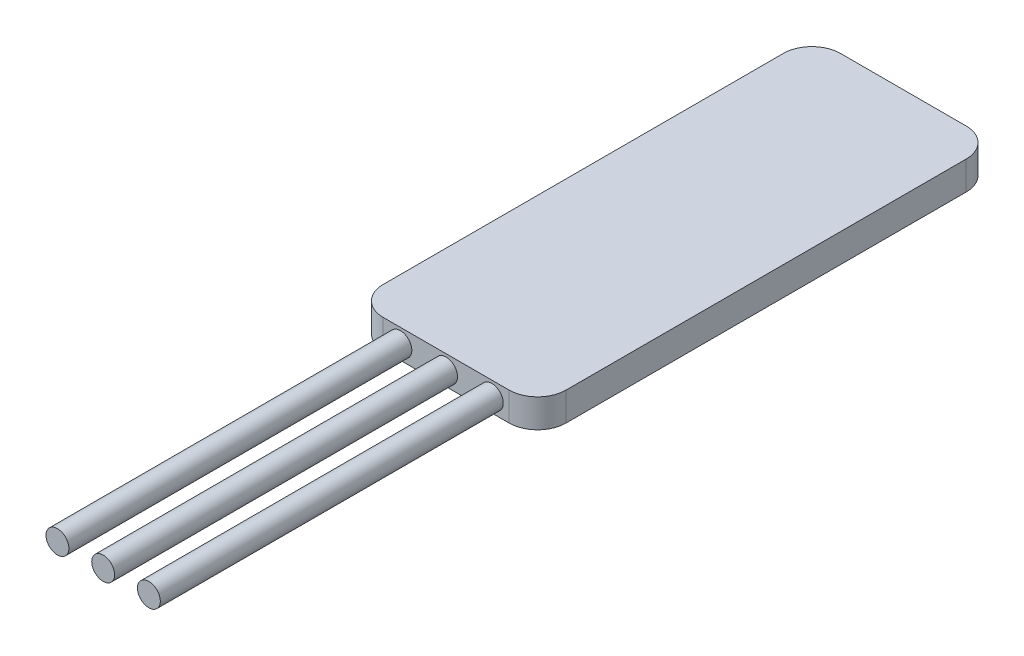
ISO-10303-21;
HEADER;
FILE_DESCRIPTION(('STEP AP214'),'2;1');
FILE_NAME('part.step','',(''),(''),'','','');
FILE_SCHEMA(('AUTOMOTIVE_DESIGN { 1 0 10303 214 1 1 1 1 }'));
ENDSEC;
DATA;
#1=APPLICATION_CONTEXT('core data for automotive mechanical design processes');
#2=APPLICATION_PROTOCOL_DEFINITION('international standard','automotive_design',2000,#1);
#3=PRODUCT_CONTEXT('',#1,'mechanical');
#4=PRODUCT('Part','Part','',(#3));
#5=PRODUCT_RELATED_PRODUCT_CATEGORY('part','',(#4));
#6=PRODUCT_DEFINITION_FORMATION('','',#4);
#7=PRODUCT_DEFINITION_CONTEXT('part definition',#1,'design');
#8=PRODUCT_DEFINITION('design','',#6,#7);
#9=PRODUCT_DEFINITION_SHAPE('','',#8);
#10=(LENGTH_UNIT() NAMED_UNIT(*) SI_UNIT(.MILLI.,.METRE.));
#11=(NAMED_UNIT(*) PLANE_ANGLE_UNIT() SI_UNIT($,.RADIAN.));
#12=(NAMED_UNIT(*) SI_UNIT($,.STERADIAN.) SOLID_ANGLE_UNIT());
#13=UNCERTAINTY_MEASURE_WITH_UNIT(LENGTH_MEASURE(1.E-05),#10,'distance_accuracy_value','');
#14=(GEOMETRIC_REPRESENTATION_CONTEXT(3) GLOBAL_UNCERTAINTY_ASSIGNED_CONTEXT((#13)) GLOBAL_UNIT_ASSIGNED_CONTEXT((#10,
#11,#12)) REPRESENTATION_CONTEXT('',''));
#15=CARTESIAN_POINT('',(0.,0.,0.));
#16=DIRECTION('',(0.,0.,1.));
#17=DIRECTION('',(1.,0.,0.));
#18=AXIS2_PLACEMENT_3D('',#15,#16,#17);
#19=CARTESIAN_POINT('',(3.2,0.5,-8.));
#20=DIRECTION('',(-1.,0.,0.));
#21=DIRECTION('',(0.,0.,1.));
#22=AXIS2_PLACEMENT_3D('',#19,#20,#21);
#23=PLANE('',#22);
#24=DIRECTION('',(0.,0.,-1.));
#25=VECTOR('',#24,1.);
#26=CARTESIAN_POINT('',(3.2,-0.5,-8.));
#27=LINE('',#26,#25);
#28=CARTESIAN_POINT('',(3.2,-0.5,7.));
#29=VERTEX_POINT('',#28);
#30=CARTESIAN_POINT('',(3.2,-0.5,-7.));
#31=VERTEX_POINT('',#30);
#32=EDGE_CURVE('E134',#29,#31,#27,.T.);
#33=ORIENTED_EDGE('',*,*,#32,.T.);
#34=DIRECTION('',(0.,-1.,0.));
#35=VECTOR('',#34,1.);
#36=CARTESIAN_POINT('',(3.2,0.5,-7.));
#37=LINE('',#36,#35);
#38=CARTESIAN_POINT('',(3.2,0.5,-7.));
#39=VERTEX_POINT('',#38);
#40=EDGE_CURVE('E156',#31,#39,#37,.F.);
#41=ORIENTED_EDGE('',*,*,#40,.T.);
#42=DIRECTION('',(0.,0.,-1.));
#43=VECTOR('',#42,1.);
#44=CARTESIAN_POINT('',(3.2,0.5,-8.));
#45=LINE('',#44,#43);
#46=CARTESIAN_POINT('',(3.2,0.5,7.));
#47=VERTEX_POINT('',#46);
#48=EDGE_CURVE('E132',#47,#39,#45,.T.);
#49=ORIENTED_EDGE('',*,*,#48,.F.);
#50=DIRECTION('',(0.,-1.,0.));
#51=VECTOR('',#50,1.);
#52=CARTESIAN_POINT('',(3.2,0.5,7.));
#53=LINE('',#52,#51);
#54=EDGE_CURVE('E153',#47,#29,#53,.T.);
#55=ORIENTED_EDGE('',*,*,#54,.T.);
#56=EDGE_LOOP('',(#33,#41,#49,#55));
#57=FACE_BOUND('',#56,.T.);
#58=ADVANCED_FACE('F36',(#57),#23,.F.);
#59=CARTESIAN_POINT('',(-3.2,0.5,-8.));
#60=DIRECTION('',(0.,0.,1.));
#61=DIRECTION('',(1.,0.,0.));
#62=AXIS2_PLACEMENT_3D('',#59,#60,#61);
#63=PLANE('',#62);
#64=DIRECTION('',(-1.,0.,0.));
#65=VECTOR('',#64,1.);
#66=CARTESIAN_POINT('',(-3.2,-0.5,-8.));
#67=LINE('',#66,#65);
#68=CARTESIAN_POINT('',(2.2,-0.5,-8.));
#69=VERTEX_POINT('',#68);
#70=CARTESIAN_POINT('',(-2.2,-0.5,-8.));
#71=VERTEX_POINT('',#70);
#72=EDGE_CURVE('E130',#69,#71,#67,.T.);
#73=ORIENTED_EDGE('',*,*,#72,.T.);
#74=DIRECTION('',(0.,-1.,0.));
#75=VECTOR('',#74,1.);
#76=CARTESIAN_POINT('',(-2.2,0.5,-8.));
#77=LINE('',#76,#75);
#78=CARTESIAN_POINT('',(-2.2,0.5,-8.));
#79=VERTEX_POINT('',#78);
#80=EDGE_CURVE('E108',#71,#79,#77,.F.);
#81=ORIENTED_EDGE('',*,*,#80,.T.);
#82=DIRECTION('',(-1.,0.,0.));
#83=VECTOR('',#82,1.);
#84=CARTESIAN_POINT('',(-3.2,0.5,-8.));
#85=LINE('',#84,#83);
#86=CARTESIAN_POINT('',(2.2,0.5,-8.));
#87=VERTEX_POINT('',#86);
#88=EDGE_CURVE('E182',#87,#79,#85,.T.);
#89=ORIENTED_EDGE('',*,*,#88,.F.);
#90=DIRECTION('',(0.,-1.,0.));
#91=VECTOR('',#90,1.);
#92=CARTESIAN_POINT('',(2.2,0.5,-8.));
#93=LINE('',#92,#91);
#94=EDGE_CURVE('E113',#87,#69,#93,.T.);
#95=ORIENTED_EDGE('',*,*,#94,.T.);
#96=EDGE_LOOP('',(#73,#81,#89,#95));
#97=FACE_BOUND('',#96,.T.);
#98=ADVANCED_FACE('F209',(#97),#63,.F.);
#99=CARTESIAN_POINT('',(-3.2,0.5,-8.));
#100=DIRECTION('',(1.,0.,0.));
#101=DIRECTION('',(0.,0.,-1.));
#102=AXIS2_PLACEMENT_3D('',#99,#100,#101);
#103=PLANE('',#102);
#104=DIRECTION('',(0.,0.,1.));
#105=VECTOR('',#104,1.);
#106=CARTESIAN_POINT('',(-3.2,0.5,-8.));
#107=LINE('',#106,#105);
#108=CARTESIAN_POINT('',(-3.2,0.5,-7.));
#109=VERTEX_POINT('',#108);
#110=CARTESIAN_POINT('',(-3.2,0.5,7.));
#111=VERTEX_POINT('',#110);
#112=EDGE_CURVE('E122',#109,#111,#107,.T.);
#113=ORIENTED_EDGE('',*,*,#112,.F.);
#114=DIRECTION('',(0.,-1.,0.));
#115=VECTOR('',#114,1.);
#116=CARTESIAN_POINT('',(-3.2,0.5,-7.));
#117=LINE('',#116,#115);
#118=CARTESIAN_POINT('',(-3.2,-0.5,-7.));
#119=VERTEX_POINT('',#118);
#120=EDGE_CURVE('E107',#109,#119,#117,.T.);
#121=ORIENTED_EDGE('',*,*,#120,.T.);
#122=DIRECTION('',(0.,0.,1.));
#123=VECTOR('',#122,1.);
#124=CARTESIAN_POINT('',(-3.2,-0.5,-8.));
#125=LINE('',#124,#123);
#126=CARTESIAN_POINT('',(-3.2,-0.5,7.));
#127=VERTEX_POINT('',#126);
#128=EDGE_CURVE('E120',#119,#127,#125,.T.);
#129=ORIENTED_EDGE('',*,*,#128,.T.);
#130=DIRECTION('',(0.,-1.,0.));
#131=VECTOR('',#130,1.);
#132=CARTESIAN_POINT('',(-3.2,0.5,7.));
#133=LINE('',#132,#131);
#134=EDGE_CURVE('E124',#127,#111,#133,.F.);
#135=ORIENTED_EDGE('',*,*,#134,.T.);
#136=EDGE_LOOP('',(#113,#121,#129,#135));
#137=FACE_BOUND('',#136,.T.);
#138=ADVANCED_FACE('F119',(#137),#103,.F.);
#139=CARTESIAN_POINT('',(-3.2,0.5,8.));
#140=DIRECTION('',(0.,0.,-1.));
#141=DIRECTION('',(-1.,0.,0.));
#142=AXIS2_PLACEMENT_3D('',#139,#140,#141);
#143=PLANE('',#142);
#144=CARTESIAN_POINT('',(1.6,0.,8.));
#145=DIRECTION('',(0.,0.,-1.));
#146=DIRECTION('',(-1.,0.,0.));
#147=AXIS2_PLACEMENT_3D('',#144,#145,#146);
#148=CIRCLE('',#147,0.4);
#149=CARTESIAN_POINT('',(1.2,0.,8.));
#150=VERTEX_POINT('',#149);
#151=EDGE_CURVE('E11',#150,#150,#148,.F.);
#152=ORIENTED_EDGE('',*,*,#151,.F.);
#153=EDGE_LOOP('',(#152));
#154=FACE_BOUND('',#153,.T.);
#155=CARTESIAN_POINT('',(-1.6,0.,8.));
#156=DIRECTION('',(0.,0.,-1.));
#157=DIRECTION('',(-1.,0.,0.));
#158=AXIS2_PLACEMENT_3D('',#155,#156,#157);
#159=CIRCLE('',#158,0.4);
#160=CARTESIAN_POINT('',(-2.,0.,8.));
#161=VERTEX_POINT('',#160);
#162=EDGE_CURVE('E44',#161,#161,#159,.F.);
#163=ORIENTED_EDGE('',*,*,#162,.F.);
#164=EDGE_LOOP('',(#163));
#165=FACE_BOUND('',#164,.T.);
#166=CARTESIAN_POINT('',(0.,0.,8.));
#167=DIRECTION('',(0.,0.,-1.));
#168=DIRECTION('',(-1.,0.,0.));
#169=AXIS2_PLACEMENT_3D('',#166,#167,#168);
#170=CIRCLE('',#169,0.4);
#171=CARTESIAN_POINT('',(-0.4,0.,8.));
#172=VERTEX_POINT('',#171);
#173=EDGE_CURVE('E162',#172,#172,#170,.F.);
#174=ORIENTED_EDGE('',*,*,#173,.F.);
#175=EDGE_LOOP('',(#174));
#176=FACE_BOUND('',#175,.T.);
#177=DIRECTION('',(1.,0.,0.));
#178=VECTOR('',#177,1.);
#179=CARTESIAN_POINT('',(-3.2,0.5,8.));
#180=LINE('',#179,#178);
#181=CARTESIAN_POINT('',(-2.2,0.5,8.));
#182=VERTEX_POINT('',#181);
#183=CARTESIAN_POINT('',(2.2,0.5,8.));
#184=VERTEX_POINT('',#183);
#185=EDGE_CURVE('E138',#182,#184,#180,.T.);
#186=ORIENTED_EDGE('',*,*,#185,.F.);
#187=DIRECTION('',(0.,-1.,0.));
#188=VECTOR('',#187,1.);
#189=CARTESIAN_POINT('',(-2.2,0.5,8.));
#190=LINE('',#189,#188);
#191=CARTESIAN_POINT('',(-2.2,-0.5,8.));
#192=VERTEX_POINT('',#191);
#193=EDGE_CURVE('E159',#182,#192,#190,.T.);
#194=ORIENTED_EDGE('',*,*,#193,.T.);
#195=DIRECTION('',(1.,0.,0.));
#196=VECTOR('',#195,1.);
#197=CARTESIAN_POINT('',(-3.2,-0.5,8.));
#198=LINE('',#197,#196);
#199=CARTESIAN_POINT('',(2.2,-0.5,8.));
#200=VERTEX_POINT('',#199);
#201=EDGE_CURVE('E129',#192,#200,#198,.T.);
#202=ORIENTED_EDGE('',*,*,#201,.T.);
#203=DIRECTION('',(0.,-1.,0.));
#204=VECTOR('',#203,1.);
#205=CARTESIAN_POINT('',(2.2,0.5,8.));
#206=LINE('',#205,#204);
#207=EDGE_CURVE('E51',#200,#184,#206,.F.);
#208=ORIENTED_EDGE('',*,*,#207,.T.);
#209=EDGE_LOOP('',(#186,#194,#202,#208));
#210=FACE_BOUND('',#209,.T.);
#211=ADVANCED_FACE('F169',(#154,#165,#176,#210),#143,.F.);
#212=CARTESIAN_POINT('',(0.,0.5,0.));
#213=DIRECTION('',(0.,1.,0.));
#214=DIRECTION('',(0.,0.,1.));
#215=AXIS2_PLACEMENT_3D('',#212,#213,#214);
#216=PLANE('',#215);
#217=ORIENTED_EDGE('',*,*,#88,.T.);
#218=CARTESIAN_POINT('',(-2.2,0.5,-7.));
#219=DIRECTION('',(0.,1.,0.));
#220=DIRECTION('',(0.,0.,1.));
#221=AXIS2_PLACEMENT_3D('',#218,#219,#220);
#222=CIRCLE('',#221,1.);
#223=EDGE_CURVE('E151',#79,#109,#222,.T.);
#224=ORIENTED_EDGE('',*,*,#223,.T.);
#225=ORIENTED_EDGE('',*,*,#112,.T.);
#226=CARTESIAN_POINT('',(-2.2,0.5,7.));
#227=DIRECTION('',(0.,1.,0.));
#228=DIRECTION('',(0.,0.,1.));
#229=AXIS2_PLACEMENT_3D('',#226,#227,#228);
#230=CIRCLE('',#229,1.);
#231=EDGE_CURVE('E58',#111,#182,#230,.T.);
#232=ORIENTED_EDGE('',*,*,#231,.T.);
#233=ORIENTED_EDGE('',*,*,#185,.T.);
#234=CARTESIAN_POINT('',(2.2,0.5,7.));
#235=DIRECTION('',(0.,1.,0.));
#236=DIRECTION('',(0.,0.,1.));
#237=AXIS2_PLACEMENT_3D('',#234,#235,#236);
#238=CIRCLE('',#237,1.);
#239=EDGE_CURVE('E146',#184,#47,#238,.T.);
#240=ORIENTED_EDGE('',*,*,#239,.T.);
#241=ORIENTED_EDGE('',*,*,#48,.T.);
#242=CARTESIAN_POINT('',(2.2,0.5,-7.));
#243=DIRECTION('',(0.,1.,0.));
#244=DIRECTION('',(0.,0.,1.));
#245=AXIS2_PLACEMENT_3D('',#242,#243,#244);
#246=CIRCLE('',#245,1.);
#247=EDGE_CURVE('E149',#39,#87,#246,.T.);
#248=ORIENTED_EDGE('',*,*,#247,.T.);
#249=EDGE_LOOP('',(#217,#224,#225,#232,#233,#240,#241,#248));
#250=FACE_BOUND('',#249,.T.);
#251=ADVANCED_FACE('F172',(#250),#216,.T.);
#252=CARTESIAN_POINT('',(0.,-0.5,0.));
#253=DIRECTION('',(0.,1.,0.));
#254=DIRECTION('',(0.,0.,1.));
#255=AXIS2_PLACEMENT_3D('',#252,#253,#254);
#256=PLANE('',#255);
#257=ORIENTED_EDGE('',*,*,#128,.F.);
#258=CARTESIAN_POINT('',(-2.2,-0.5,-7.));
#259=DIRECTION('',(0.,1.,0.));
#260=DIRECTION('',(0.,0.,1.));
#261=AXIS2_PLACEMENT_3D('',#258,#259,#260);
#262=CIRCLE('',#261,1.);
#263=EDGE_CURVE('E103',#119,#71,#262,.F.);
#264=ORIENTED_EDGE('',*,*,#263,.T.);
#265=ORIENTED_EDGE('',*,*,#72,.F.);
#266=CARTESIAN_POINT('',(2.2,-0.5,-7.));
#267=DIRECTION('',(0.,1.,0.));
#268=DIRECTION('',(0.,0.,1.));
#269=AXIS2_PLACEMENT_3D('',#266,#267,#268);
#270=CIRCLE('',#269,1.);
#271=EDGE_CURVE('E114',#69,#31,#270,.F.);
#272=ORIENTED_EDGE('',*,*,#271,.T.);
#273=ORIENTED_EDGE('',*,*,#32,.F.);
#274=CARTESIAN_POINT('',(2.2,-0.5,7.));
#275=DIRECTION('',(0.,1.,0.));
#276=DIRECTION('',(0.,0.,1.));
#277=AXIS2_PLACEMENT_3D('',#274,#275,#276);
#278=CIRCLE('',#277,1.);
#279=EDGE_CURVE('E123',#29,#200,#278,.F.);
#280=ORIENTED_EDGE('',*,*,#279,.T.);
#281=ORIENTED_EDGE('',*,*,#201,.F.);
#282=CARTESIAN_POINT('',(-2.2,-0.5,7.));
#283=DIRECTION('',(0.,1.,0.));
#284=DIRECTION('',(0.,0.,1.));
#285=AXIS2_PLACEMENT_3D('',#282,#283,#284);
#286=CIRCLE('',#285,1.);
#287=EDGE_CURVE('E128',#192,#127,#286,.F.);
#288=ORIENTED_EDGE('',*,*,#287,.T.);
#289=EDGE_LOOP('',(#257,#264,#265,#272,#273,#280,#281,#288));
#290=FACE_BOUND('',#289,.T.);
#291=ADVANCED_FACE('F126',(#290),#256,.F.);
#292=CARTESIAN_POINT('',(-2.2,0.5,-7.));
#293=DIRECTION('',(0.,-1.,0.));
#294=DIRECTION('',(0.,0.,-1.));
#295=AXIS2_PLACEMENT_3D('',#292,#293,#294);
#296=CYLINDRICAL_SURFACE('',#295,1.);
#297=ORIENTED_EDGE('',*,*,#223,.F.);
#298=ORIENTED_EDGE('',*,*,#80,.F.);
#299=ORIENTED_EDGE('',*,*,#263,.F.);
#300=ORIENTED_EDGE('',*,*,#120,.F.);
#301=EDGE_LOOP('',(#297,#298,#299,#300));
#302=FACE_BOUND('',#301,.T.);
#303=ADVANCED_FACE('F106',(#302),#296,.T.);
#304=CARTESIAN_POINT('',(2.2,0.5,-7.));
#305=DIRECTION('',(0.,-1.,0.));
#306=DIRECTION('',(0.,0.,-1.));
#307=AXIS2_PLACEMENT_3D('',#304,#305,#306);
#308=CYLINDRICAL_SURFACE('',#307,1.);
#309=ORIENTED_EDGE('',*,*,#247,.F.);
#310=ORIENTED_EDGE('',*,*,#40,.F.);
#311=ORIENTED_EDGE('',*,*,#271,.F.);
#312=ORIENTED_EDGE('',*,*,#94,.F.);
#313=EDGE_LOOP('',(#309,#310,#311,#312));
#314=FACE_BOUND('',#313,.T.);
#315=ADVANCED_FACE('F207',(#314),#308,.T.);
#316=CARTESIAN_POINT('',(-2.2,0.5,7.));
#317=DIRECTION('',(0.,-1.,0.));
#318=DIRECTION('',(0.,0.,-1.));
#319=AXIS2_PLACEMENT_3D('',#316,#317,#318);
#320=CYLINDRICAL_SURFACE('',#319,1.);
#321=ORIENTED_EDGE('',*,*,#231,.F.);
#322=ORIENTED_EDGE('',*,*,#134,.F.);
#323=ORIENTED_EDGE('',*,*,#287,.F.);
#324=ORIENTED_EDGE('',*,*,#193,.F.);
#325=EDGE_LOOP('',(#321,#322,#323,#324));
#326=FACE_BOUND('',#325,.T.);
#327=ADVANCED_FACE('F180',(#326),#320,.T.);
#328=CARTESIAN_POINT('',(2.2,0.5,7.));
#329=DIRECTION('',(0.,-1.,0.));
#330=DIRECTION('',(0.,0.,-1.));
#331=AXIS2_PLACEMENT_3D('',#328,#329,#330);
#332=CYLINDRICAL_SURFACE('',#331,1.);
#333=ORIENTED_EDGE('',*,*,#239,.F.);
#334=ORIENTED_EDGE('',*,*,#207,.F.);
#335=ORIENTED_EDGE('',*,*,#279,.F.);
#336=ORIENTED_EDGE('',*,*,#54,.F.);
#337=EDGE_LOOP('',(#333,#334,#335,#336));
#338=FACE_BOUND('',#337,.T.);
#339=ADVANCED_FACE('F38',(#338),#332,.T.);
#340=CARTESIAN_POINT('',(0.,0.,20.));
#341=DIRECTION('',(0.,0.,-1.));
#342=DIRECTION('',(-1.,0.,0.));
#343=AXIS2_PLACEMENT_3D('',#340,#341,#342);
#344=CYLINDRICAL_SURFACE('',#343,0.4);
#345=CARTESIAN_POINT('',(0.,0.,20.));
#346=DIRECTION('',(0.,0.,1.));
#347=DIRECTION('',(1.,0.,0.));
#348=AXIS2_PLACEMENT_3D('',#345,#346,#347);
#349=CIRCLE('',#348,0.4);
#350=CARTESIAN_POINT('',(0.4,0.,20.));
#351=VERTEX_POINT('',#350);
#352=EDGE_CURVE('E187',#351,#351,#349,.T.);
#353=ORIENTED_EDGE('',*,*,#352,.F.);
#354=EDGE_LOOP('',(#353));
#355=FACE_BOUND('',#354,.T.);
#356=ORIENTED_EDGE('',*,*,#173,.T.);
#357=EDGE_LOOP('',(#356));
#358=FACE_BOUND('',#357,.T.);
#359=ADVANCED_FACE('F226',(#355,#358),#344,.T.);
#360=CARTESIAN_POINT('',(0.,0.,20.));
#361=DIRECTION('',(0.,0.,1.));
#362=DIRECTION('',(1.,0.,0.));
#363=AXIS2_PLACEMENT_3D('',#360,#361,#362);
#364=PLANE('',#363);
#365=ORIENTED_EDGE('',*,*,#352,.T.);
#366=EDGE_LOOP('',(#365));
#367=FACE_BOUND('',#366,.T.);
#368=ADVANCED_FACE('F230',(#367),#364,.T.);
#369=CARTESIAN_POINT('',(-1.6,0.,20.));
#370=DIRECTION('',(0.,0.,-1.));
#371=DIRECTION('',(-1.,0.,0.));
#372=AXIS2_PLACEMENT_3D('',#369,#370,#371);
#373=CYLINDRICAL_SURFACE('',#372,0.4);
#374=CARTESIAN_POINT('',(-1.6,0.,20.));
#375=DIRECTION('',(0.,0.,1.));
#376=DIRECTION('',(1.,0.,0.));
#377=AXIS2_PLACEMENT_3D('',#374,#375,#376);
#378=CIRCLE('',#377,0.4);
#379=CARTESIAN_POINT('',(-1.2,0.,20.));
#380=VERTEX_POINT('',#379);
#381=EDGE_CURVE('E192',#380,#380,#378,.T.);
#382=ORIENTED_EDGE('',*,*,#381,.F.);
#383=EDGE_LOOP('',(#382));
#384=FACE_BOUND('',#383,.T.);
#385=ORIENTED_EDGE('',*,*,#162,.T.);
#386=EDGE_LOOP('',(#385));
#387=FACE_BOUND('',#386,.T.);
#388=ADVANCED_FACE('F167',(#384,#387),#373,.T.);
#389=CARTESIAN_POINT('',(-1.6,0.,20.));
#390=DIRECTION('',(0.,0.,1.));
#391=DIRECTION('',(1.,0.,0.));
#392=AXIS2_PLACEMENT_3D('',#389,#390,#391);
#393=PLANE('',#392);
#394=ORIENTED_EDGE('',*,*,#381,.T.);
#395=EDGE_LOOP('',(#394));
#396=FACE_BOUND('',#395,.T.);
#397=ADVANCED_FACE('F298',(#396),#393,.T.);
#398=CARTESIAN_POINT('',(1.6,0.,20.));
#399=DIRECTION('',(0.,0.,-1.));
#400=DIRECTION('',(-1.,0.,0.));
#401=AXIS2_PLACEMENT_3D('',#398,#399,#400);
#402=CYLINDRICAL_SURFACE('',#401,0.4);
#403=CARTESIAN_POINT('',(1.6,0.,20.));
#404=DIRECTION('',(0.,0.,1.));
#405=DIRECTION('',(1.,0.,0.));
#406=AXIS2_PLACEMENT_3D('',#403,#404,#405);
#407=CIRCLE('',#406,0.4);
#408=CARTESIAN_POINT('',(2.,0.,20.));
#409=VERTEX_POINT('',#408);
#410=EDGE_CURVE('E197',#409,#409,#407,.T.);
#411=ORIENTED_EDGE('',*,*,#410,.F.);
#412=EDGE_LOOP('',(#411));
#413=FACE_BOUND('',#412,.T.);
#414=ORIENTED_EDGE('',*,*,#151,.T.);
#415=EDGE_LOOP('',(#414));
#416=FACE_BOUND('',#415,.T.);
#417=ADVANCED_FACE('F305',(#413,#416),#402,.T.);
#418=CARTESIAN_POINT('',(1.6,0.,20.));
#419=DIRECTION('',(0.,0.,1.));
#420=DIRECTION('',(1.,0.,0.));
#421=AXIS2_PLACEMENT_3D('',#418,#419,#420);
#422=PLANE('',#421);
#423=ORIENTED_EDGE('',*,*,#410,.T.);
#424=EDGE_LOOP('',(#423));
#425=FACE_BOUND('',#424,.T.);
#426=ADVANCED_FACE('F313',(#425),#422,.T.);
#427=CLOSED_SHELL('',(#58,#98,#138,#211,#251,#291,#303,#315,#327,#339,#359,#368,#388,#397,#417,#426));
#428=MANIFOLD_SOLID_BREP('B2',#427);
#429=ADVANCED_BREP_SHAPE_REPRESENTATION('',(#18,#428),#14);
#430=SHAPE_DEFINITION_REPRESENTATION(#9,#429);
ENDSEC;
END-ISO-10303-21;
